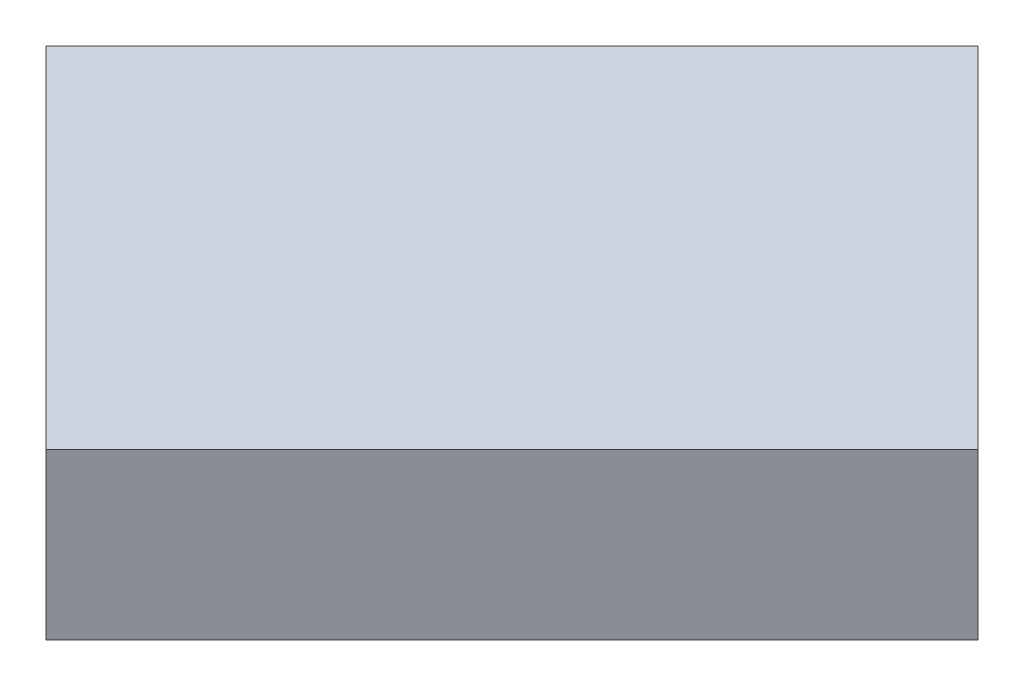
ISO-10303-21;
HEADER;
FILE_DESCRIPTION(('STEP AP214'),'2;1');
FILE_NAME('part.step','',(''),(''),'','','');
FILE_SCHEMA(('AUTOMOTIVE_DESIGN { 1 0 10303 214 1 1 1 1 }'));
ENDSEC;
DATA;
#1=APPLICATION_CONTEXT('core data for automotive mechanical design processes');
#2=APPLICATION_PROTOCOL_DEFINITION('international standard','automotive_design',2000,#1);
#3=PRODUCT_CONTEXT('',#1,'mechanical');
#4=PRODUCT('Part','Part','',(#3));
#5=PRODUCT_RELATED_PRODUCT_CATEGORY('part','',(#4));
#6=PRODUCT_DEFINITION_FORMATION('','',#4);
#7=PRODUCT_DEFINITION_CONTEXT('part definition',#1,'design');
#8=PRODUCT_DEFINITION('design','',#6,#7);
#9=PRODUCT_DEFINITION_SHAPE('','',#8);
#10=(LENGTH_UNIT() NAMED_UNIT(*) SI_UNIT(.MILLI.,.METRE.));
#11=(NAMED_UNIT(*) PLANE_ANGLE_UNIT() SI_UNIT($,.RADIAN.));
#12=(NAMED_UNIT(*) SI_UNIT($,.STERADIAN.) SOLID_ANGLE_UNIT());
#13=UNCERTAINTY_MEASURE_WITH_UNIT(LENGTH_MEASURE(1.E-05),#10,'distance_accuracy_value','');
#14=(GEOMETRIC_REPRESENTATION_CONTEXT(3) GLOBAL_UNCERTAINTY_ASSIGNED_CONTEXT((#13)) GLOBAL_UNIT_ASSIGNED_CONTEXT((#10,
#11,#12)) REPRESENTATION_CONTEXT('',''));
#15=CARTESIAN_POINT('',(0.,0.,0.));
#16=DIRECTION('',(0.,0.,1.));
#17=DIRECTION('',(1.,0.,0.));
#18=AXIS2_PLACEMENT_3D('',#15,#16,#17);
#19=CARTESIAN_POINT('',(85.9955660912353,-78.179187174374,-124.097240098237));
#20=DIRECTION('',(0.,1.,0.));
#21=DIRECTION('',(-1.,0.,0.));
#22=AXIS2_PLACEMENT_3D('',#19,#20,#21);
#23=PLANE('',#22);
#24=DIRECTION('',(-0.707106781186551,0.,0.707106781186544));
#25=VECTOR('',#24,1.);
#26=CARTESIAN_POINT('',(88.8239932159814,-78.179187174374,-126.925667222983));
#27=LINE('',#26,#25);
#28=CARTESIAN_POINT('',(85.995566091235,-78.179187174374,-124.097240098237));
#29=VERTEX_POINT('',#28);
#30=CARTESIAN_POINT('',(88.8239932159814,-78.179187174374,-126.925667222983));
#31=VERTEX_POINT('',#30);
#32=EDGE_CURVE('E19',#29,#31,#27,.F.);
#33=ORIENTED_EDGE('',*,*,#32,.F.);
#34=DIRECTION('',(0.707106781186541,0.,0.707106781186554));
#35=VECTOR('',#34,1.);
#36=CARTESIAN_POINT('',(85.9955660912349,-78.179187174374,-124.097240098237));
#37=LINE('',#36,#35);
#38=CARTESIAN_POINT('',(88.1168864347945,-78.179187174374,-121.975919754677));
#39=VERTEX_POINT('',#38);
#40=EDGE_CURVE('E57',#39,#29,#37,.F.);
#41=ORIENTED_EDGE('',*,*,#40,.F.);
#42=DIRECTION('',(0.707106781186552,0.,-0.707106781186543));
#43=VECTOR('',#42,1.);
#44=CARTESIAN_POINT('',(88.1168864347947,-78.1791871743739,-121.975919754678));
#45=LINE('',#44,#43);
#46=CARTESIAN_POINT('',(90.9453135595409,-78.179187174374,-124.804346879424));
#47=VERTEX_POINT('',#46);
#48=EDGE_CURVE('E52',#47,#39,#45,.F.);
#49=ORIENTED_EDGE('',*,*,#48,.F.);
#50=DIRECTION('',(-0.707106781186547,0.,-0.707106781186548));
#51=VECTOR('',#50,1.);
#52=CARTESIAN_POINT('',(90.9453135595409,-78.179187174374,-124.804346879424));
#53=LINE('',#52,#51);
#54=EDGE_CURVE('E67',#31,#47,#53,.F.);
#55=ORIENTED_EDGE('',*,*,#54,.F.);
#56=EDGE_LOOP('',(#33,#41,#49,#55));
#57=FACE_BOUND('',#56,.T.);
#58=ADVANCED_FACE('F16',(#57),#23,.T.);
#59=CARTESIAN_POINT('',(88.8239932159814,-79.179187174374,-126.925667222983));
#60=DIRECTION('',(-0.707106781186544,0.,-0.707106781186551));
#61=DIRECTION('',(-0.707106781186551,0.,0.707106781186544));
#62=AXIS2_PLACEMENT_3D('',#59,#60,#61);
#63=PLANE('',#62);
#64=ORIENTED_EDGE('',*,*,#32,.T.);
#65=DIRECTION('',(0.,1.,0.));
#66=VECTOR('',#65,1.);
#67=CARTESIAN_POINT('',(88.8239932159816,-79.1791871743739,-126.925667222983));
#68=LINE('',#67,#66);
#69=CARTESIAN_POINT('',(88.8239932159814,-79.179187174374,-126.925667222983));
#70=VERTEX_POINT('',#69);
#71=EDGE_CURVE('E78',#70,#31,#68,.T.);
#72=ORIENTED_EDGE('',*,*,#71,.F.);
#73=DIRECTION('',(-0.707106781186568,0.,0.707106781186527));
#74=VECTOR('',#73,1.);
#75=CARTESIAN_POINT('',(88.8239932159813,-79.179187174374,-126.925667222983));
#76=LINE('',#75,#74);
#77=CARTESIAN_POINT('',(85.9955660912351,-79.179187174374,-124.097240098237));
#78=VERTEX_POINT('',#77);
#79=EDGE_CURVE('E73',#70,#78,#76,.T.);
#80=ORIENTED_EDGE('',*,*,#79,.T.);
#81=DIRECTION('',(0.,1.,0.));
#82=VECTOR('',#81,1.);
#83=CARTESIAN_POINT('',(85.995566091235,-79.179187174374,-124.097240098237));
#84=LINE('',#83,#82);
#85=EDGE_CURVE('E62',#29,#78,#84,.F.);
#86=ORIENTED_EDGE('',*,*,#85,.F.);
#87=EDGE_LOOP('',(#64,#72,#80,#86));
#88=FACE_BOUND('',#87,.T.);
#89=ADVANCED_FACE('F72',(#88),#63,.T.);
#90=CARTESIAN_POINT('',(85.9955660912349,-79.179187174374,-124.097240098237));
#91=DIRECTION('',(-0.707106781186554,0.,0.707106781186541));
#92=DIRECTION('',(0.707106781186541,0.,0.707106781186554));
#93=AXIS2_PLACEMENT_3D('',#90,#91,#92);
#94=PLANE('',#93);
#95=ORIENTED_EDGE('',*,*,#40,.T.);
#96=ORIENTED_EDGE('',*,*,#85,.T.);
#97=DIRECTION('',(0.707106781186527,0.,0.707106781186568));
#98=VECTOR('',#97,1.);
#99=CARTESIAN_POINT('',(85.995566091235,-79.179187174374,-124.097240098237));
#100=LINE('',#99,#98);
#101=CARTESIAN_POINT('',(88.1168864347945,-79.179187174374,-121.975919754677));
#102=VERTEX_POINT('',#101);
#103=EDGE_CURVE('E83',#78,#102,#100,.T.);
#104=ORIENTED_EDGE('',*,*,#103,.T.);
#105=DIRECTION('',(0.,1.,0.));
#106=VECTOR('',#105,1.);
#107=CARTESIAN_POINT('',(88.1168864347942,-79.179187174374,-121.975919754678));
#108=LINE('',#107,#106);
#109=EDGE_CURVE('E64',#39,#102,#108,.F.);
#110=ORIENTED_EDGE('',*,*,#109,.F.);
#111=EDGE_LOOP('',(#95,#96,#104,#110));
#112=FACE_BOUND('',#111,.T.);
#113=ADVANCED_FACE('F59',(#112),#94,.T.);
#114=CARTESIAN_POINT('',(88.1168864347947,-79.179187174374,-121.975919754678));
#115=DIRECTION('',(0.707106781186543,0.,0.707106781186552));
#116=DIRECTION('',(0.707106781186552,0.,-0.707106781186543));
#117=AXIS2_PLACEMENT_3D('',#114,#115,#116);
#118=PLANE('',#117);
#119=ORIENTED_EDGE('',*,*,#48,.T.);
#120=ORIENTED_EDGE('',*,*,#109,.T.);
#121=DIRECTION('',(0.707106781186471,0.,-0.707106781186624));
#122=VECTOR('',#121,1.);
#123=CARTESIAN_POINT('',(88.1168864347946,-79.179187174374,-121.975919754677));
#124=LINE('',#123,#122);
#125=CARTESIAN_POINT('',(90.9453135595408,-79.179187174374,-124.804346879424));
#126=VERTEX_POINT('',#125);
#127=EDGE_CURVE('E25',#102,#126,#124,.T.);
#128=ORIENTED_EDGE('',*,*,#127,.T.);
#129=DIRECTION('',(0.,1.,0.));
#130=VECTOR('',#129,1.);
#131=CARTESIAN_POINT('',(90.9453135595409,-79.1791871743739,-124.804346879424));
#132=LINE('',#131,#130);
#133=EDGE_CURVE('E33',#47,#126,#132,.F.);
#134=ORIENTED_EDGE('',*,*,#133,.F.);
#135=EDGE_LOOP('',(#119,#120,#128,#134));
#136=FACE_BOUND('',#135,.T.);
#137=ADVANCED_FACE('F87',(#136),#118,.T.);
#138=CARTESIAN_POINT('',(90.9453135595409,-79.1791871743739,-124.804346879424));
#139=DIRECTION('',(0.707106781186548,0.,-0.707106781186547));
#140=DIRECTION('',(-0.707106781186547,0.,-0.707106781186548));
#141=AXIS2_PLACEMENT_3D('',#138,#139,#140);
#142=PLANE('',#141);
#143=ORIENTED_EDGE('',*,*,#54,.T.);
#144=ORIENTED_EDGE('',*,*,#133,.T.);
#145=DIRECTION('',(-0.707106781186638,0.,-0.707106781186457));
#146=VECTOR('',#145,1.);
#147=CARTESIAN_POINT('',(90.9453135595409,-79.179187174374,-124.804346879424));
#148=LINE('',#147,#146);
#149=EDGE_CURVE('E11',#126,#70,#148,.T.);
#150=ORIENTED_EDGE('',*,*,#149,.T.);
#151=ORIENTED_EDGE('',*,*,#71,.T.);
#152=EDGE_LOOP('',(#143,#144,#150,#151));
#153=FACE_BOUND('',#152,.T.);
#154=ADVANCED_FACE('F90',(#153),#142,.T.);
#155=CARTESIAN_POINT('',(85.9955660912353,-79.179187174374,-124.097240098237));
#156=DIRECTION('',(0.,1.,0.));
#157=DIRECTION('',(-1.,0.,0.));
#158=AXIS2_PLACEMENT_3D('',#155,#156,#157);
#159=PLANE('',#158);
#160=ORIENTED_EDGE('',*,*,#127,.F.);
#161=ORIENTED_EDGE('',*,*,#103,.F.);
#162=ORIENTED_EDGE('',*,*,#79,.F.);
#163=ORIENTED_EDGE('',*,*,#149,.F.);
#164=EDGE_LOOP('',(#160,#161,#162,#163));
#165=FACE_BOUND('',#164,.T.);
#166=ADVANCED_FACE('F89',(#165),#159,.F.);
#167=CLOSED_SHELL('',(#58,#89,#113,#137,#154,#166));
#168=MANIFOLD_SOLID_BREP('B1',#167);
#169=ADVANCED_BREP_SHAPE_REPRESENTATION('',(#18,#168),#14);
#170=SHAPE_DEFINITION_REPRESENTATION(#9,#169);
ENDSEC;
END-ISO-10303-21;
